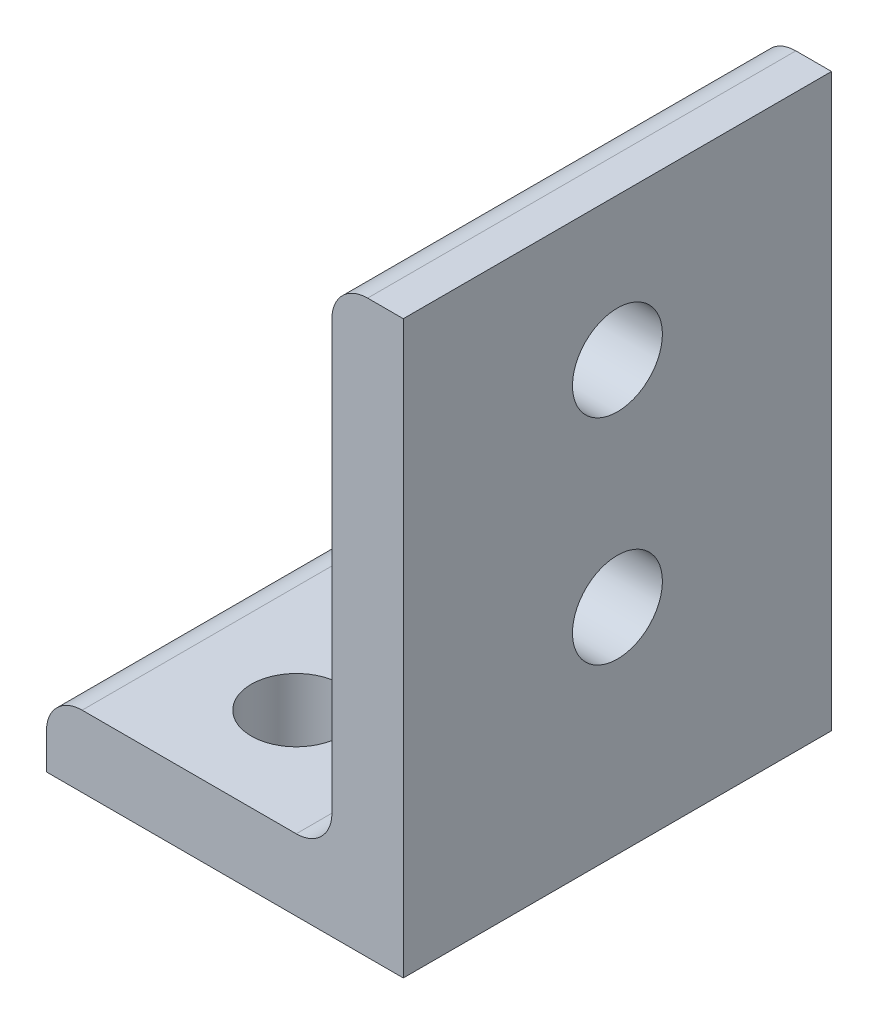
ISO-10303-21;
HEADER;
FILE_DESCRIPTION(('STEP AP214'),'2;1');
FILE_NAME('part.step','',(''),(''),'','','');
FILE_SCHEMA(('AUTOMOTIVE_DESIGN { 1 0 10303 214 1 1 1 1 }'));
ENDSEC;
DATA;
#1=APPLICATION_CONTEXT('core data for automotive mechanical design processes');
#2=APPLICATION_PROTOCOL_DEFINITION('international standard','automotive_design',2000,#1);
#3=PRODUCT_CONTEXT('',#1,'mechanical');
#4=PRODUCT('Part','Part','',(#3));
#5=PRODUCT_RELATED_PRODUCT_CATEGORY('part','',(#4));
#6=PRODUCT_DEFINITION_FORMATION('','',#4);
#7=PRODUCT_DEFINITION_CONTEXT('part definition',#1,'design');
#8=PRODUCT_DEFINITION('design','',#6,#7);
#9=PRODUCT_DEFINITION_SHAPE('','',#8);
#10=(LENGTH_UNIT() NAMED_UNIT(*) SI_UNIT(.MILLI.,.METRE.));
#11=(NAMED_UNIT(*) PLANE_ANGLE_UNIT() SI_UNIT($,.RADIAN.));
#12=(NAMED_UNIT(*) SI_UNIT($,.STERADIAN.) SOLID_ANGLE_UNIT());
#13=UNCERTAINTY_MEASURE_WITH_UNIT(LENGTH_MEASURE(1.E-05),#10,'distance_accuracy_value','');
#14=(GEOMETRIC_REPRESENTATION_CONTEXT(3) GLOBAL_UNCERTAINTY_ASSIGNED_CONTEXT((#13)) GLOBAL_UNIT_ASSIGNED_CONTEXT((#10,
#11,#12)) REPRESENTATION_CONTEXT('',''));
#15=CARTESIAN_POINT('',(0.,0.,0.));
#16=DIRECTION('',(0.,0.,1.));
#17=DIRECTION('',(1.,0.,0.));
#18=AXIS2_PLACEMENT_3D('',#15,#16,#17);
#19=CARTESIAN_POINT('',(-15.875,3.175,19.05));
#20=DIRECTION('',(1.,0.,0.));
#21=DIRECTION('',(0.,0.,-1.));
#22=AXIS2_PLACEMENT_3D('',#19,#20,#21);
#23=PLANE('',#22);
#24=DIRECTION('',(0.,-1.,0.));
#25=VECTOR('',#24,1.);
#26=CARTESIAN_POINT('',(-15.875,3.175,-19.05));
#27=LINE('',#26,#25);
#28=CARTESIAN_POINT('',(-15.875,3.175,-19.05));
#29=VERTEX_POINT('',#28);
#30=CARTESIAN_POINT('',(-15.875,0.,-19.05));
#31=VERTEX_POINT('',#30);
#32=EDGE_CURVE('E139',#29,#31,#27,.T.);
#33=ORIENTED_EDGE('',*,*,#32,.T.);
#34=DIRECTION('',(0.,0.,-1.));
#35=VECTOR('',#34,1.);
#36=CARTESIAN_POINT('',(-15.875,0.,19.05));
#37=LINE('',#36,#35);
#38=CARTESIAN_POINT('',(-15.875,0.,19.05));
#39=VERTEX_POINT('',#38);
#40=EDGE_CURVE('E11',#39,#31,#37,.T.);
#41=ORIENTED_EDGE('',*,*,#40,.F.);
#42=DIRECTION('',(0.,-1.,0.));
#43=VECTOR('',#42,1.);
#44=CARTESIAN_POINT('',(-15.875,3.175,19.05));
#45=LINE('',#44,#43);
#46=CARTESIAN_POINT('',(-15.875,3.175,19.05));
#47=VERTEX_POINT('',#46);
#48=EDGE_CURVE('E156',#47,#39,#45,.T.);
#49=ORIENTED_EDGE('',*,*,#48,.F.);
#50=DIRECTION('',(0.,0.,-1.));
#51=VECTOR('',#50,1.);
#52=CARTESIAN_POINT('',(-15.875,3.175,19.05));
#53=LINE('',#52,#51);
#54=EDGE_CURVE('E135',#47,#29,#53,.T.);
#55=ORIENTED_EDGE('',*,*,#54,.T.);
#56=EDGE_LOOP('',(#33,#41,#49,#55));
#57=FACE_BOUND('',#56,.T.);
#58=ADVANCED_FACE('F37',(#57),#23,.F.);
#59=CARTESIAN_POINT('',(-15.875,0.,19.05));
#60=DIRECTION('',(0.,1.,0.));
#61=DIRECTION('',(0.,0.,1.));
#62=AXIS2_PLACEMENT_3D('',#59,#60,#61);
#63=PLANE('',#62);
#64=CARTESIAN_POINT('',(-3.17499999999999,0.,-9.525));
#65=DIRECTION('',(0.,1.,0.));
#66=DIRECTION('',(-1.,0.,0.));
#67=AXIS2_PLACEMENT_3D('',#64,#65,#66);
#68=CIRCLE('',#67,4.);
#69=CARTESIAN_POINT('',(-7.17499999999999,0.,-9.525));
#70=VERTEX_POINT('',#69);
#71=EDGE_CURVE('E143',#70,#70,#68,.T.);
#72=ORIENTED_EDGE('',*,*,#71,.T.);
#73=EDGE_LOOP('',(#72));
#74=FACE_BOUND('',#73,.T.);
#75=CARTESIAN_POINT('',(-3.17499999999999,0.,9.525));
#76=DIRECTION('',(0.,1.,0.));
#77=DIRECTION('',(1.,0.,0.));
#78=AXIS2_PLACEMENT_3D('',#75,#76,#77);
#79=CIRCLE('',#78,4.);
#80=CARTESIAN_POINT('',(-7.17499999999999,0.,9.525));
#81=VERTEX_POINT('',#80);
#82=EDGE_CURVE('E200',#81,#81,#79,.T.);
#83=ORIENTED_EDGE('',*,*,#82,.T.);
#84=EDGE_LOOP('',(#83));
#85=FACE_BOUND('',#84,.T.);
#86=DIRECTION('',(1.,0.,0.));
#87=VECTOR('',#86,1.);
#88=CARTESIAN_POINT('',(-15.875,0.,-19.05));
#89=LINE('',#88,#87);
#90=CARTESIAN_POINT('',(15.875,0.,-19.05));
#91=VERTEX_POINT('',#90);
#92=EDGE_CURVE('E142',#31,#91,#89,.T.);
#93=ORIENTED_EDGE('',*,*,#92,.T.);
#94=DIRECTION('',(0.,0.,-1.));
#95=VECTOR('',#94,1.);
#96=CARTESIAN_POINT('',(15.875,0.,19.05));
#97=LINE('',#96,#95);
#98=CARTESIAN_POINT('',(15.875,0.,19.05));
#99=VERTEX_POINT('',#98);
#100=EDGE_CURVE('E45',#99,#91,#97,.T.);
#101=ORIENTED_EDGE('',*,*,#100,.F.);
#102=DIRECTION('',(1.,0.,0.));
#103=VECTOR('',#102,1.);
#104=CARTESIAN_POINT('',(-15.875,0.,19.05));
#105=LINE('',#104,#103);
#106=EDGE_CURVE('E99',#39,#99,#105,.T.);
#107=ORIENTED_EDGE('',*,*,#106,.F.);
#108=ORIENTED_EDGE('',*,*,#40,.T.);
#109=EDGE_LOOP('',(#93,#101,#107,#108));
#110=FACE_BOUND('',#109,.T.);
#111=ADVANCED_FACE('F251',(#74,#85,#110),#63,.F.);
#112=CARTESIAN_POINT('',(15.875,0.,19.05));
#113=DIRECTION('',(-1.,0.,0.));
#114=DIRECTION('',(0.,0.,1.));
#115=AXIS2_PLACEMENT_3D('',#112,#113,#114);
#116=PLANE('',#115);
#117=CARTESIAN_POINT('',(15.875,38.1,0.));
#118=DIRECTION('',(-1.,0.,0.));
#119=DIRECTION('',(0.,-1.,0.));
#120=AXIS2_PLACEMENT_3D('',#117,#118,#119);
#121=CIRCLE('',#120,4.);
#122=CARTESIAN_POINT('',(15.875,34.1,0.));
#123=VERTEX_POINT('',#122);
#124=EDGE_CURVE('E201',#123,#123,#121,.T.);
#125=ORIENTED_EDGE('',*,*,#124,.T.);
#126=EDGE_LOOP('',(#125));
#127=FACE_BOUND('',#126,.T.);
#128=CARTESIAN_POINT('',(15.875,19.05,0.));
#129=DIRECTION('',(-1.,0.,0.));
#130=DIRECTION('',(0.,1.,0.));
#131=AXIS2_PLACEMENT_3D('',#128,#129,#130);
#132=CIRCLE('',#131,4.);
#133=CARTESIAN_POINT('',(15.875,23.05,0.));
#134=VERTEX_POINT('',#133);
#135=EDGE_CURVE('E212',#134,#134,#132,.T.);
#136=ORIENTED_EDGE('',*,*,#135,.T.);
#137=EDGE_LOOP('',(#136));
#138=FACE_BOUND('',#137,.T.);
#139=DIRECTION('',(0.,1.,0.));
#140=VECTOR('',#139,1.);
#141=CARTESIAN_POINT('',(15.875,0.,-19.05));
#142=LINE('',#141,#140);
#143=CARTESIAN_POINT('',(15.875,50.8,-19.05));
#144=VERTEX_POINT('',#143);
#145=EDGE_CURVE('E145',#91,#144,#142,.T.);
#146=ORIENTED_EDGE('',*,*,#145,.T.);
#147=DIRECTION('',(0.,0.,-1.));
#148=VECTOR('',#147,1.);
#149=CARTESIAN_POINT('',(15.875,50.8,19.05));
#150=LINE('',#149,#148);
#151=CARTESIAN_POINT('',(15.875,50.8,19.05));
#152=VERTEX_POINT('',#151);
#153=EDGE_CURVE('E166',#152,#144,#150,.T.);
#154=ORIENTED_EDGE('',*,*,#153,.F.);
#155=DIRECTION('',(0.,1.,0.));
#156=VECTOR('',#155,1.);
#157=CARTESIAN_POINT('',(15.875,0.,19.05));
#158=LINE('',#157,#156);
#159=EDGE_CURVE('E174',#99,#152,#158,.T.);
#160=ORIENTED_EDGE('',*,*,#159,.F.);
#161=ORIENTED_EDGE('',*,*,#100,.T.);
#162=EDGE_LOOP('',(#146,#154,#160,#161));
#163=FACE_BOUND('',#162,.T.);
#164=ADVANCED_FACE('F172',(#127,#138,#163),#116,.F.);
#165=CARTESIAN_POINT('',(12.7,50.8,19.05));
#166=DIRECTION('',(0.,-1.,0.));
#167=DIRECTION('',(0.,0.,-1.));
#168=AXIS2_PLACEMENT_3D('',#165,#166,#167);
#169=PLANE('',#168);
#170=DIRECTION('',(-1.,0.,0.));
#171=VECTOR('',#170,1.);
#172=CARTESIAN_POINT('',(12.7,50.8,-19.05));
#173=LINE('',#172,#171);
#174=CARTESIAN_POINT('',(12.7,50.8,-19.05));
#175=VERTEX_POINT('',#174);
#176=EDGE_CURVE('E147',#144,#175,#173,.T.);
#177=ORIENTED_EDGE('',*,*,#176,.T.);
#178=DIRECTION('',(0.,0.,-1.));
#179=VECTOR('',#178,1.);
#180=CARTESIAN_POINT('',(12.7,50.8,19.05));
#181=LINE('',#180,#179);
#182=CARTESIAN_POINT('',(12.7,50.8,19.05));
#183=VERTEX_POINT('',#182);
#184=EDGE_CURVE('E163',#183,#175,#181,.T.);
#185=ORIENTED_EDGE('',*,*,#184,.F.);
#186=DIRECTION('',(-1.,0.,0.));
#187=VECTOR('',#186,1.);
#188=CARTESIAN_POINT('',(12.7,50.8,19.05));
#189=LINE('',#188,#187);
#190=EDGE_CURVE('E190',#152,#183,#189,.T.);
#191=ORIENTED_EDGE('',*,*,#190,.F.);
#192=ORIENTED_EDGE('',*,*,#153,.T.);
#193=EDGE_LOOP('',(#177,#185,#191,#192));
#194=FACE_BOUND('',#193,.T.);
#195=ADVANCED_FACE('F183',(#194),#169,.F.);
#196=CARTESIAN_POINT('',(12.7,47.625,19.05));
#197=DIRECTION('',(0.,0.,-1.));
#198=DIRECTION('',(-1.,0.,0.));
#199=AXIS2_PLACEMENT_3D('',#196,#197,#198);
#200=CYLINDRICAL_SURFACE('',#199,3.175);
#201=CARTESIAN_POINT('',(12.7,47.625,-19.05));
#202=DIRECTION('',(0.,0.,1.));
#203=DIRECTION('',(-1.,0.,0.));
#204=AXIS2_PLACEMENT_3D('',#201,#202,#203);
#205=CIRCLE('',#204,3.175);
#206=CARTESIAN_POINT('',(9.52500000000001,47.625,-19.05));
#207=VERTEX_POINT('',#206);
#208=EDGE_CURVE('E149',#175,#207,#205,.T.);
#209=ORIENTED_EDGE('',*,*,#208,.T.);
#210=DIRECTION('',(0.,0.,-1.));
#211=VECTOR('',#210,1.);
#212=CARTESIAN_POINT('',(9.52500000000001,47.625,19.05));
#213=LINE('',#212,#211);
#214=CARTESIAN_POINT('',(9.52500000000001,47.625,19.05));
#215=VERTEX_POINT('',#214);
#216=EDGE_CURVE('E160',#215,#207,#213,.T.);
#217=ORIENTED_EDGE('',*,*,#216,.F.);
#218=CARTESIAN_POINT('',(12.7,47.625,19.05));
#219=DIRECTION('',(0.,0.,1.));
#220=DIRECTION('',(-1.,0.,0.));
#221=AXIS2_PLACEMENT_3D('',#218,#219,#220);
#222=CIRCLE('',#221,3.175);
#223=EDGE_CURVE('E189',#183,#215,#222,.T.);
#224=ORIENTED_EDGE('',*,*,#223,.F.);
#225=ORIENTED_EDGE('',*,*,#184,.T.);
#226=EDGE_LOOP('',(#209,#217,#224,#225));
#227=FACE_BOUND('',#226,.T.);
#228=ADVANCED_FACE('F187',(#227),#200,.T.);
#229=CARTESIAN_POINT('',(9.52500000000001,47.625,19.05));
#230=DIRECTION('',(1.,0.,0.));
#231=DIRECTION('',(0.,1.,0.));
#232=AXIS2_PLACEMENT_3D('',#229,#230,#231);
#233=PLANE('',#232);
#234=CARTESIAN_POINT('',(9.52500000000001,38.1,0.));
#235=DIRECTION('',(-1.,0.,0.));
#236=DIRECTION('',(0.,-1.,0.));
#237=AXIS2_PLACEMENT_3D('',#234,#235,#236);
#238=CIRCLE('',#237,4.);
#239=CARTESIAN_POINT('',(9.52500000000001,34.1,0.));
#240=VERTEX_POINT('',#239);
#241=EDGE_CURVE('E215',#240,#240,#238,.T.);
#242=ORIENTED_EDGE('',*,*,#241,.F.);
#243=EDGE_LOOP('',(#242));
#244=FACE_BOUND('',#243,.T.);
#245=CARTESIAN_POINT('',(9.52500000000001,19.05,0.));
#246=DIRECTION('',(-1.,0.,0.));
#247=DIRECTION('',(0.,1.,0.));
#248=AXIS2_PLACEMENT_3D('',#245,#246,#247);
#249=CIRCLE('',#248,4.);
#250=CARTESIAN_POINT('',(9.52500000000001,23.05,0.));
#251=VERTEX_POINT('',#250);
#252=EDGE_CURVE('E209',#251,#251,#249,.T.);
#253=ORIENTED_EDGE('',*,*,#252,.F.);
#254=EDGE_LOOP('',(#253));
#255=FACE_BOUND('',#254,.T.);
#256=DIRECTION('',(0.,-1.,0.));
#257=VECTOR('',#256,1.);
#258=CARTESIAN_POINT('',(9.52500000000001,47.625,-19.05));
#259=LINE('',#258,#257);
#260=CARTESIAN_POINT('',(9.52500000000001,9.525,-19.05));
#261=VERTEX_POINT('',#260);
#262=EDGE_CURVE('E151',#207,#261,#259,.T.);
#263=ORIENTED_EDGE('',*,*,#262,.T.);
#264=DIRECTION('',(0.,0.,-1.));
#265=VECTOR('',#264,1.);
#266=CARTESIAN_POINT('',(9.52500000000001,9.525,19.05));
#267=LINE('',#266,#265);
#268=CARTESIAN_POINT('',(9.52500000000001,9.525,19.05));
#269=VERTEX_POINT('',#268);
#270=EDGE_CURVE('E130',#269,#261,#267,.T.);
#271=ORIENTED_EDGE('',*,*,#270,.F.);
#272=DIRECTION('',(0.,-1.,0.));
#273=VECTOR('',#272,1.);
#274=CARTESIAN_POINT('',(9.52500000000001,47.625,19.05));
#275=LINE('',#274,#273);
#276=EDGE_CURVE('E121',#215,#269,#275,.T.);
#277=ORIENTED_EDGE('',*,*,#276,.F.);
#278=ORIENTED_EDGE('',*,*,#216,.T.);
#279=EDGE_LOOP('',(#263,#271,#277,#278));
#280=FACE_BOUND('',#279,.T.);
#281=ADVANCED_FACE('F230',(#244,#255,#280),#233,.F.);
#282=CARTESIAN_POINT('',(6.35000000000001,9.525,19.05));
#283=DIRECTION('',(0.,0.,-1.));
#284=DIRECTION('',(-1.,0.,0.));
#285=AXIS2_PLACEMENT_3D('',#282,#283,#284);
#286=CYLINDRICAL_SURFACE('',#285,3.175);
#287=CARTESIAN_POINT('',(6.35000000000001,9.525,-19.05));
#288=DIRECTION('',(0.,0.,-1.));
#289=DIRECTION('',(-1.,0.,0.));
#290=AXIS2_PLACEMENT_3D('',#287,#288,#289);
#291=CIRCLE('',#290,3.175);
#292=CARTESIAN_POINT('',(6.35000000000001,6.35,-19.05));
#293=VERTEX_POINT('',#292);
#294=EDGE_CURVE('E129',#261,#293,#291,.T.);
#295=ORIENTED_EDGE('',*,*,#294,.T.);
#296=DIRECTION('',(0.,0.,-1.));
#297=VECTOR('',#296,1.);
#298=CARTESIAN_POINT('',(6.35000000000001,6.35,19.05));
#299=LINE('',#298,#297);
#300=CARTESIAN_POINT('',(6.35000000000001,6.35,19.05));
#301=VERTEX_POINT('',#300);
#302=EDGE_CURVE('E126',#301,#293,#299,.T.);
#303=ORIENTED_EDGE('',*,*,#302,.F.);
#304=CARTESIAN_POINT('',(6.35000000000001,9.525,19.05));
#305=DIRECTION('',(0.,0.,-1.));
#306=DIRECTION('',(-1.,0.,0.));
#307=AXIS2_PLACEMENT_3D('',#304,#305,#306);
#308=CIRCLE('',#307,3.175);
#309=EDGE_CURVE('E115',#269,#301,#308,.T.);
#310=ORIENTED_EDGE('',*,*,#309,.F.);
#311=ORIENTED_EDGE('',*,*,#270,.T.);
#312=EDGE_LOOP('',(#295,#303,#310,#311));
#313=FACE_BOUND('',#312,.T.);
#314=ADVANCED_FACE('F127',(#313),#286,.F.);
#315=CARTESIAN_POINT('',(6.35000000000001,6.35,19.05));
#316=DIRECTION('',(0.,-1.,0.));
#317=DIRECTION('',(1.,0.,0.));
#318=AXIS2_PLACEMENT_3D('',#315,#316,#317);
#319=PLANE('',#318);
#320=CARTESIAN_POINT('',(-3.17499999999999,6.35,-9.525));
#321=DIRECTION('',(0.,1.,0.));
#322=DIRECTION('',(-1.,0.,0.));
#323=AXIS2_PLACEMENT_3D('',#320,#321,#322);
#324=CIRCLE('',#323,4.);
#325=CARTESIAN_POINT('',(-7.17499999999999,6.35,-9.525));
#326=VERTEX_POINT('',#325);
#327=EDGE_CURVE('E204',#326,#326,#324,.T.);
#328=ORIENTED_EDGE('',*,*,#327,.F.);
#329=EDGE_LOOP('',(#328));
#330=FACE_BOUND('',#329,.T.);
#331=CARTESIAN_POINT('',(-3.17499999999999,6.35,9.525));
#332=DIRECTION('',(0.,1.,0.));
#333=DIRECTION('',(1.,0.,0.));
#334=AXIS2_PLACEMENT_3D('',#331,#332,#333);
#335=CIRCLE('',#334,4.);
#336=CARTESIAN_POINT('',(-7.17499999999999,6.35,9.525));
#337=VERTEX_POINT('',#336);
#338=EDGE_CURVE('E197',#337,#337,#335,.T.);
#339=ORIENTED_EDGE('',*,*,#338,.F.);
#340=EDGE_LOOP('',(#339));
#341=FACE_BOUND('',#340,.T.);
#342=DIRECTION('',(-1.,0.,0.));
#343=VECTOR('',#342,1.);
#344=CARTESIAN_POINT('',(6.35000000000001,6.35,-19.05));
#345=LINE('',#344,#343);
#346=CARTESIAN_POINT('',(-12.7,6.35,-19.05));
#347=VERTEX_POINT('',#346);
#348=EDGE_CURVE('E85',#293,#347,#345,.T.);
#349=ORIENTED_EDGE('',*,*,#348,.T.);
#350=DIRECTION('',(0.,0.,-1.));
#351=VECTOR('',#350,1.);
#352=CARTESIAN_POINT('',(-12.7,6.35,19.05));
#353=LINE('',#352,#351);
#354=CARTESIAN_POINT('',(-12.7,6.35,19.05));
#355=VERTEX_POINT('',#354);
#356=EDGE_CURVE('E131',#355,#347,#353,.T.);
#357=ORIENTED_EDGE('',*,*,#356,.F.);
#358=DIRECTION('',(-1.,0.,0.));
#359=VECTOR('',#358,1.);
#360=CARTESIAN_POINT('',(6.35000000000001,6.35,19.05));
#361=LINE('',#360,#359);
#362=EDGE_CURVE('E119',#301,#355,#361,.T.);
#363=ORIENTED_EDGE('',*,*,#362,.F.);
#364=ORIENTED_EDGE('',*,*,#302,.T.);
#365=EDGE_LOOP('',(#349,#357,#363,#364));
#366=FACE_BOUND('',#365,.T.);
#367=ADVANCED_FACE('F133',(#330,#341,#366),#319,.F.);
#368=CARTESIAN_POINT('',(-12.7,3.175,19.05));
#369=DIRECTION('',(0.,0.,-1.));
#370=DIRECTION('',(-1.,0.,0.));
#371=AXIS2_PLACEMENT_3D('',#368,#369,#370);
#372=CYLINDRICAL_SURFACE('',#371,3.175);
#373=CARTESIAN_POINT('',(-12.7,3.175,-19.05));
#374=DIRECTION('',(0.,0.,1.));
#375=DIRECTION('',(-1.,0.,0.));
#376=AXIS2_PLACEMENT_3D('',#373,#374,#375);
#377=CIRCLE('',#376,3.175);
#378=EDGE_CURVE('E91',#347,#29,#377,.T.);
#379=ORIENTED_EDGE('',*,*,#378,.T.);
#380=ORIENTED_EDGE('',*,*,#54,.F.);
#381=CARTESIAN_POINT('',(-12.7,3.175,19.05));
#382=DIRECTION('',(0.,0.,1.));
#383=DIRECTION('',(-1.,0.,0.));
#384=AXIS2_PLACEMENT_3D('',#381,#382,#383);
#385=CIRCLE('',#384,3.175);
#386=EDGE_CURVE('E53',#355,#47,#385,.T.);
#387=ORIENTED_EDGE('',*,*,#386,.F.);
#388=ORIENTED_EDGE('',*,*,#356,.T.);
#389=EDGE_LOOP('',(#379,#380,#387,#388));
#390=FACE_BOUND('',#389,.T.);
#391=ADVANCED_FACE('F239',(#390),#372,.T.);
#392=CARTESIAN_POINT('',(12.7,47.625,19.05));
#393=DIRECTION('',(0.,0.,-1.));
#394=DIRECTION('',(-1.,0.,0.));
#395=AXIS2_PLACEMENT_3D('',#392,#393,#394);
#396=PLANE('',#395);
#397=ORIENTED_EDGE('',*,*,#48,.T.);
#398=ORIENTED_EDGE('',*,*,#106,.T.);
#399=ORIENTED_EDGE('',*,*,#159,.T.);
#400=ORIENTED_EDGE('',*,*,#190,.T.);
#401=ORIENTED_EDGE('',*,*,#223,.T.);
#402=ORIENTED_EDGE('',*,*,#276,.T.);
#403=ORIENTED_EDGE('',*,*,#309,.T.);
#404=ORIENTED_EDGE('',*,*,#362,.T.);
#405=ORIENTED_EDGE('',*,*,#386,.T.);
#406=EDGE_LOOP('',(#397,#398,#399,#400,#401,#402,#403,#404,#405));
#407=FACE_BOUND('',#406,.T.);
#408=ADVANCED_FACE('F117',(#407),#396,.F.);
#409=CARTESIAN_POINT('',(12.7,47.625,-19.05));
#410=DIRECTION('',(0.,0.,-1.));
#411=DIRECTION('',(-1.,0.,0.));
#412=AXIS2_PLACEMENT_3D('',#409,#410,#411);
#413=PLANE('',#412);
#414=ORIENTED_EDGE('',*,*,#32,.F.);
#415=ORIENTED_EDGE('',*,*,#378,.F.);
#416=ORIENTED_EDGE('',*,*,#348,.F.);
#417=ORIENTED_EDGE('',*,*,#294,.F.);
#418=ORIENTED_EDGE('',*,*,#262,.F.);
#419=ORIENTED_EDGE('',*,*,#208,.F.);
#420=ORIENTED_EDGE('',*,*,#176,.F.);
#421=ORIENTED_EDGE('',*,*,#145,.F.);
#422=ORIENTED_EDGE('',*,*,#92,.F.);
#423=EDGE_LOOP('',(#414,#415,#416,#417,#418,#419,#420,#421,#422));
#424=FACE_BOUND('',#423,.T.);
#425=ADVANCED_FACE('F178',(#424),#413,.T.);
#426=CARTESIAN_POINT('',(-3.17499999999999,0.,9.525));
#427=DIRECTION('',(0.,1.,0.));
#428=DIRECTION('',(-1.,0.,0.));
#429=AXIS2_PLACEMENT_3D('',#426,#427,#428);
#430=CYLINDRICAL_SURFACE('',#429,4.);
#431=CARTESIAN_POINT('',(-7.17499999999999,0.,9.525));
#432=CARTESIAN_POINT('',(-7.17499999999999,0.0661458333333313,9.525));
#433=CARTESIAN_POINT('',(-7.17499999999999,0.132291666666665,9.525));
#434=CARTESIAN_POINT('',(-7.17499999999999,0.264583333333331,9.525));
#435=CARTESIAN_POINT('',(-7.17499999999999,0.330729166666665,9.525));
#436=CARTESIAN_POINT('',(-7.17499999999999,0.463020833333331,9.525));
#437=CARTESIAN_POINT('',(-7.17499999999999,0.529166666666665,9.525));
#438=CARTESIAN_POINT('',(-7.17499999999999,0.661458333333331,9.525));
#439=CARTESIAN_POINT('',(-7.17499999999999,0.727604166666665,9.525));
#440=CARTESIAN_POINT('',(-7.17499999999999,0.859895833333331,9.525));
#441=CARTESIAN_POINT('',(-7.17499999999999,0.926041666666665,9.525));
#442=CARTESIAN_POINT('',(-7.17499999999999,1.05833333333333,9.525));
#443=CARTESIAN_POINT('',(-7.17499999999999,1.12447916666666,9.525));
#444=CARTESIAN_POINT('',(-7.17499999999999,1.25677083333333,9.525));
#445=CARTESIAN_POINT('',(-7.17499999999999,1.32291666666666,9.525));
#446=CARTESIAN_POINT('',(-7.17499999999999,1.45520833333333,9.525));
#447=CARTESIAN_POINT('',(-7.17499999999999,1.52135416666666,9.525));
#448=CARTESIAN_POINT('',(-7.17499999999999,1.65364583333333,9.525));
#449=CARTESIAN_POINT('',(-7.17499999999999,1.71979166666666,9.525));
#450=CARTESIAN_POINT('',(-7.17499999999999,1.85208333333333,9.525));
#451=CARTESIAN_POINT('',(-7.17499999999999,1.91822916666666,9.525));
#452=CARTESIAN_POINT('',(-7.17499999999999,2.05052083333333,9.525));
#453=CARTESIAN_POINT('',(-7.17499999999999,2.11666666666666,9.525));
#454=CARTESIAN_POINT('',(-7.17499999999999,2.24895833333333,9.525));
#455=CARTESIAN_POINT('',(-7.17499999999999,2.31510416666666,9.525));
#456=CARTESIAN_POINT('',(-7.17499999999999,2.44739583333333,9.525));
#457=CARTESIAN_POINT('',(-7.17499999999999,2.51354166666666,9.525));
#458=CARTESIAN_POINT('',(-7.17499999999999,2.64583333333333,9.525));
#459=CARTESIAN_POINT('',(-7.17499999999999,2.71197916666666,9.525));
#460=CARTESIAN_POINT('',(-7.17499999999999,2.84427083333333,9.525));
#461=CARTESIAN_POINT('',(-7.17499999999999,2.91041666666667,9.525));
#462=CARTESIAN_POINT('',(-7.17499999999999,3.04270833333333,9.525));
#463=CARTESIAN_POINT('',(-7.17499999999999,3.10885416666666,9.525));
#464=CARTESIAN_POINT('',(-7.17499999999999,3.24114583333333,9.525));
#465=CARTESIAN_POINT('',(-7.17499999999999,3.30729166666666,9.525));
#466=CARTESIAN_POINT('',(-7.17499999999999,3.43958333333333,9.525));
#467=CARTESIAN_POINT('',(-7.17499999999999,3.50572916666667,9.525));
#468=CARTESIAN_POINT('',(-7.17499999999999,3.63802083333333,9.525));
#469=CARTESIAN_POINT('',(-7.17499999999999,3.70416666666667,9.525));
#470=CARTESIAN_POINT('',(-7.17499999999999,3.83645833333333,9.525));
#471=CARTESIAN_POINT('',(-7.17499999999999,3.90260416666667,9.525));
#472=CARTESIAN_POINT('',(-7.17499999999999,4.03489583333333,9.525));
#473=CARTESIAN_POINT('',(-7.17499999999999,4.10104166666667,9.525));
#474=CARTESIAN_POINT('',(-7.17499999999999,4.23333333333333,9.525));
#475=CARTESIAN_POINT('',(-7.17499999999999,4.29947916666667,9.525));
#476=CARTESIAN_POINT('',(-7.17499999999999,4.43177083333333,9.525));
#477=CARTESIAN_POINT('',(-7.17499999999999,4.49791666666667,9.525));
#478=CARTESIAN_POINT('',(-7.17499999999999,4.63020833333333,9.525));
#479=CARTESIAN_POINT('',(-7.17499999999999,4.69635416666667,9.525));
#480=CARTESIAN_POINT('',(-7.17499999999999,4.82864583333333,9.525));
#481=CARTESIAN_POINT('',(-7.17499999999999,4.89479166666667,9.525));
#482=CARTESIAN_POINT('',(-7.17499999999999,5.02708333333333,9.525));
#483=CARTESIAN_POINT('',(-7.17499999999999,5.09322916666667,9.525));
#484=CARTESIAN_POINT('',(-7.17499999999999,5.22552083333333,9.525));
#485=CARTESIAN_POINT('',(-7.17499999999999,5.29166666666667,9.525));
#486=CARTESIAN_POINT('',(-7.17499999999999,5.42395833333333,9.525));
#487=CARTESIAN_POINT('',(-7.17499999999999,5.49010416666667,9.525));
#488=CARTESIAN_POINT('',(-7.17499999999999,5.62239583333333,9.525));
#489=CARTESIAN_POINT('',(-7.17499999999999,5.68854166666667,9.525));
#490=CARTESIAN_POINT('',(-7.17499999999999,5.82083333333333,9.525));
#491=CARTESIAN_POINT('',(-7.17499999999999,5.88697916666667,9.525));
#492=CARTESIAN_POINT('',(-7.17499999999999,6.01927083333333,9.525));
#493=CARTESIAN_POINT('',(-7.17499999999999,6.08541666666667,9.525));
#494=CARTESIAN_POINT('',(-7.17499999999999,6.21770833333333,9.525));
#495=CARTESIAN_POINT('',(-7.17499999999999,6.28385416666667,9.525));
#496=CARTESIAN_POINT('',(-7.17499999999999,6.35,9.525));
#497=B_SPLINE_CURVE_WITH_KNOTS('',3,(#431,#432,#433,#434,#435,#436,#437,#438,#439,#440,#441,
#442,#443,#444,#445,#446,#447,#448,#449,#450,#451,#452,#453,#454,#455,#456,#457,#458,#459,#460,
#461,#462,#463,#464,#465,#466,#467,#468,#469,#470,#471,#472,#473,#474,#475,#476,#477,#478,#479,
#480,#481,#482,#483,#484,#485,#486,#487,#488,#489,#490,#491,#492,#493,#494,#495,#496),
.UNSPECIFIED.,.F.,.F.,(4,2,2,2,2,2,2,2,2,2,2,2,2,2,2,2,2,2,2,2,2,2,2,2,2,2,2,2,2,2,2,2,4),(0.,
0.1984375,0.396875,0.5953125,0.79375,0.9921875,1.190625,1.3890625,1.5875,1.7859375,1.984375,
2.1828125,2.38125,2.5796875,2.778125,2.9765625,3.175,3.3734375,3.571875,3.7703125,3.96875,
4.1671875,4.365625,4.5640625,4.7625,4.9609375,5.159375,5.3578125,5.55625,5.7546875,5.953125,
6.1515625,6.35),.UNSPECIFIED.);
#498=EDGE_CURVE('BSEAM285',#81,#337,#497,.T.);
#499=ORIENTED_EDGE('',*,*,#82,.F.);
#500=ORIENTED_EDGE('',*,*,#338,.T.);
#501=ORIENTED_EDGE('',*,*,#498,.T.);
#502=ORIENTED_EDGE('',*,*,#498,.F.);
#503=EDGE_LOOP('',(#499,#501,#500,#502));
#504=FACE_BOUND('',#503,.T.);
#505=ADVANCED_FACE('F285',(#504),#430,.F.);
#506=CARTESIAN_POINT('',(-3.17499999999999,0.,-9.525));
#507=DIRECTION('',(0.,1.,0.));
#508=DIRECTION('',(-1.,0.,0.));
#509=AXIS2_PLACEMENT_3D('',#506,#507,#508);
#510=CYLINDRICAL_SURFACE('',#509,4.);
#511=CARTESIAN_POINT('',(-7.17499999999999,0.,-9.525));
#512=CARTESIAN_POINT('',(-7.17499999999999,0.0661458333333313,-9.525));
#513=CARTESIAN_POINT('',(-7.17499999999999,0.132291666666665,-9.525));
#514=CARTESIAN_POINT('',(-7.17499999999999,0.264583333333331,-9.525));
#515=CARTESIAN_POINT('',(-7.17499999999999,0.330729166666665,-9.525));
#516=CARTESIAN_POINT('',(-7.17499999999999,0.463020833333331,-9.525));
#517=CARTESIAN_POINT('',(-7.17499999999999,0.529166666666665,-9.525));
#518=CARTESIAN_POINT('',(-7.17499999999999,0.661458333333331,-9.525));
#519=CARTESIAN_POINT('',(-7.17499999999999,0.727604166666665,-9.525));
#520=CARTESIAN_POINT('',(-7.17499999999999,0.859895833333331,-9.525));
#521=CARTESIAN_POINT('',(-7.17499999999999,0.926041666666665,-9.525));
#522=CARTESIAN_POINT('',(-7.17499999999999,1.05833333333333,-9.525));
#523=CARTESIAN_POINT('',(-7.17499999999999,1.12447916666666,-9.525));
#524=CARTESIAN_POINT('',(-7.17499999999999,1.25677083333333,-9.525));
#525=CARTESIAN_POINT('',(-7.17499999999999,1.32291666666666,-9.525));
#526=CARTESIAN_POINT('',(-7.17499999999999,1.45520833333333,-9.525));
#527=CARTESIAN_POINT('',(-7.17499999999999,1.52135416666666,-9.525));
#528=CARTESIAN_POINT('',(-7.17499999999999,1.65364583333333,-9.525));
#529=CARTESIAN_POINT('',(-7.17499999999999,1.71979166666666,-9.525));
#530=CARTESIAN_POINT('',(-7.17499999999999,1.85208333333333,-9.525));
#531=CARTESIAN_POINT('',(-7.17499999999999,1.91822916666666,-9.525));
#532=CARTESIAN_POINT('',(-7.17499999999999,2.05052083333333,-9.525));
#533=CARTESIAN_POINT('',(-7.17499999999999,2.11666666666666,-9.525));
#534=CARTESIAN_POINT('',(-7.17499999999999,2.24895833333333,-9.525));
#535=CARTESIAN_POINT('',(-7.17499999999999,2.31510416666666,-9.525));
#536=CARTESIAN_POINT('',(-7.17499999999999,2.44739583333333,-9.525));
#537=CARTESIAN_POINT('',(-7.17499999999999,2.51354166666666,-9.525));
#538=CARTESIAN_POINT('',(-7.17499999999999,2.64583333333333,-9.525));
#539=CARTESIAN_POINT('',(-7.17499999999999,2.71197916666666,-9.525));
#540=CARTESIAN_POINT('',(-7.17499999999999,2.84427083333333,-9.525));
#541=CARTESIAN_POINT('',(-7.17499999999999,2.91041666666667,-9.525));
#542=CARTESIAN_POINT('',(-7.17499999999999,3.04270833333333,-9.525));
#543=CARTESIAN_POINT('',(-7.17499999999999,3.10885416666666,-9.525));
#544=CARTESIAN_POINT('',(-7.17499999999999,3.24114583333333,-9.525));
#545=CARTESIAN_POINT('',(-7.17499999999999,3.30729166666666,-9.525));
#546=CARTESIAN_POINT('',(-7.17499999999999,3.43958333333333,-9.525));
#547=CARTESIAN_POINT('',(-7.17499999999999,3.50572916666667,-9.525));
#548=CARTESIAN_POINT('',(-7.17499999999999,3.63802083333333,-9.525));
#549=CARTESIAN_POINT('',(-7.17499999999999,3.70416666666667,-9.525));
#550=CARTESIAN_POINT('',(-7.17499999999999,3.83645833333333,-9.525));
#551=CARTESIAN_POINT('',(-7.17499999999999,3.90260416666667,-9.525));
#552=CARTESIAN_POINT('',(-7.17499999999999,4.03489583333333,-9.525));
#553=CARTESIAN_POINT('',(-7.17499999999999,4.10104166666667,-9.525));
#554=CARTESIAN_POINT('',(-7.17499999999999,4.23333333333333,-9.525));
#555=CARTESIAN_POINT('',(-7.17499999999999,4.29947916666667,-9.525));
#556=CARTESIAN_POINT('',(-7.17499999999999,4.43177083333333,-9.525));
#557=CARTESIAN_POINT('',(-7.17499999999999,4.49791666666667,-9.525));
#558=CARTESIAN_POINT('',(-7.17499999999999,4.63020833333333,-9.525));
#559=CARTESIAN_POINT('',(-7.17499999999999,4.69635416666667,-9.525));
#560=CARTESIAN_POINT('',(-7.17499999999999,4.82864583333333,-9.525));
#561=CARTESIAN_POINT('',(-7.17499999999999,4.89479166666667,-9.525));
#562=CARTESIAN_POINT('',(-7.17499999999999,5.02708333333333,-9.525));
#563=CARTESIAN_POINT('',(-7.17499999999999,5.09322916666667,-9.525));
#564=CARTESIAN_POINT('',(-7.17499999999999,5.22552083333333,-9.525));
#565=CARTESIAN_POINT('',(-7.17499999999999,5.29166666666667,-9.525));
#566=CARTESIAN_POINT('',(-7.17499999999999,5.42395833333333,-9.525));
#567=CARTESIAN_POINT('',(-7.17499999999999,5.49010416666667,-9.525));
#568=CARTESIAN_POINT('',(-7.17499999999999,5.62239583333333,-9.525));
#569=CARTESIAN_POINT('',(-7.17499999999999,5.68854166666667,-9.525));
#570=CARTESIAN_POINT('',(-7.17499999999999,5.82083333333333,-9.525));
#571=CARTESIAN_POINT('',(-7.17499999999999,5.88697916666667,-9.525));
#572=CARTESIAN_POINT('',(-7.17499999999999,6.01927083333333,-9.525));
#573=CARTESIAN_POINT('',(-7.17499999999999,6.08541666666667,-9.525));
#574=CARTESIAN_POINT('',(-7.17499999999999,6.21770833333333,-9.525));
#575=CARTESIAN_POINT('',(-7.17499999999999,6.28385416666667,-9.525));
#576=CARTESIAN_POINT('',(-7.17499999999999,6.35,-9.525));
#577=B_SPLINE_CURVE_WITH_KNOTS('',3,(#511,#512,#513,#514,#515,#516,#517,#518,#519,#520,#521,
#522,#523,#524,#525,#526,#527,#528,#529,#530,#531,#532,#533,#534,#535,#536,#537,#538,#539,#540,
#541,#542,#543,#544,#545,#546,#547,#548,#549,#550,#551,#552,#553,#554,#555,#556,#557,#558,#559,
#560,#561,#562,#563,#564,#565,#566,#567,#568,#569,#570,#571,#572,#573,#574,#575,#576),
.UNSPECIFIED.,.F.,.F.,(4,2,2,2,2,2,2,2,2,2,2,2,2,2,2,2,2,2,2,2,2,2,2,2,2,2,2,2,2,2,2,2,4),(0.,
0.1984375,0.396875,0.5953125,0.79375,0.9921875,1.190625,1.3890625,1.5875,1.7859375,1.984375,
2.1828125,2.38125,2.5796875,2.778125,2.9765625,3.175,3.3734375,3.571875,3.7703125,3.96875,
4.1671875,4.365625,4.5640625,4.7625,4.9609375,5.159375,5.3578125,5.55625,5.7546875,5.953125,
6.1515625,6.35),.UNSPECIFIED.);
#578=EDGE_CURVE('BSEAM290',#70,#326,#577,.T.);
#579=ORIENTED_EDGE('',*,*,#71,.F.);
#580=ORIENTED_EDGE('',*,*,#327,.T.);
#581=ORIENTED_EDGE('',*,*,#578,.T.);
#582=ORIENTED_EDGE('',*,*,#578,.F.);
#583=EDGE_LOOP('',(#579,#581,#580,#582));
#584=FACE_BOUND('',#583,.T.);
#585=ADVANCED_FACE('F290',(#584),#510,.F.);
#586=CARTESIAN_POINT('',(15.875,19.05,0.));
#587=DIRECTION('',(-1.,0.,0.));
#588=DIRECTION('',(0.,-1.,0.));
#589=AXIS2_PLACEMENT_3D('',#586,#587,#588);
#590=CYLINDRICAL_SURFACE('',#589,4.);
#591=ORIENTED_EDGE('',*,*,#135,.F.);
#592=EDGE_LOOP('',(#591));
#593=FACE_BOUND('',#592,.T.);
#594=ORIENTED_EDGE('',*,*,#252,.T.);
#595=EDGE_LOOP('',(#594));
#596=FACE_BOUND('',#595,.T.);
#597=ADVANCED_FACE('F226',(#593,#596),#590,.F.);
#598=CARTESIAN_POINT('',(15.875,38.1,0.));
#599=DIRECTION('',(-1.,0.,0.));
#600=DIRECTION('',(0.,-1.,0.));
#601=AXIS2_PLACEMENT_3D('',#598,#599,#600);
#602=CYLINDRICAL_SURFACE('',#601,4.);
#603=ORIENTED_EDGE('',*,*,#124,.F.);
#604=EDGE_LOOP('',(#603));
#605=FACE_BOUND('',#604,.T.);
#606=ORIENTED_EDGE('',*,*,#241,.T.);
#607=EDGE_LOOP('',(#606));
#608=FACE_BOUND('',#607,.T.);
#609=ADVANCED_FACE('F223',(#605,#608),#602,.F.);
#610=CLOSED_SHELL('',(#58,#111,#164,#195,#228,#281,#314,#367,#391,#408,#425,#505,#585,#597,#609));
#611=MANIFOLD_SOLID_BREP('B2',#610);
#612=ADVANCED_BREP_SHAPE_REPRESENTATION('',(#18,#611),#14);
#613=SHAPE_DEFINITION_REPRESENTATION(#9,#612);
ENDSEC;
END-ISO-10303-21;
